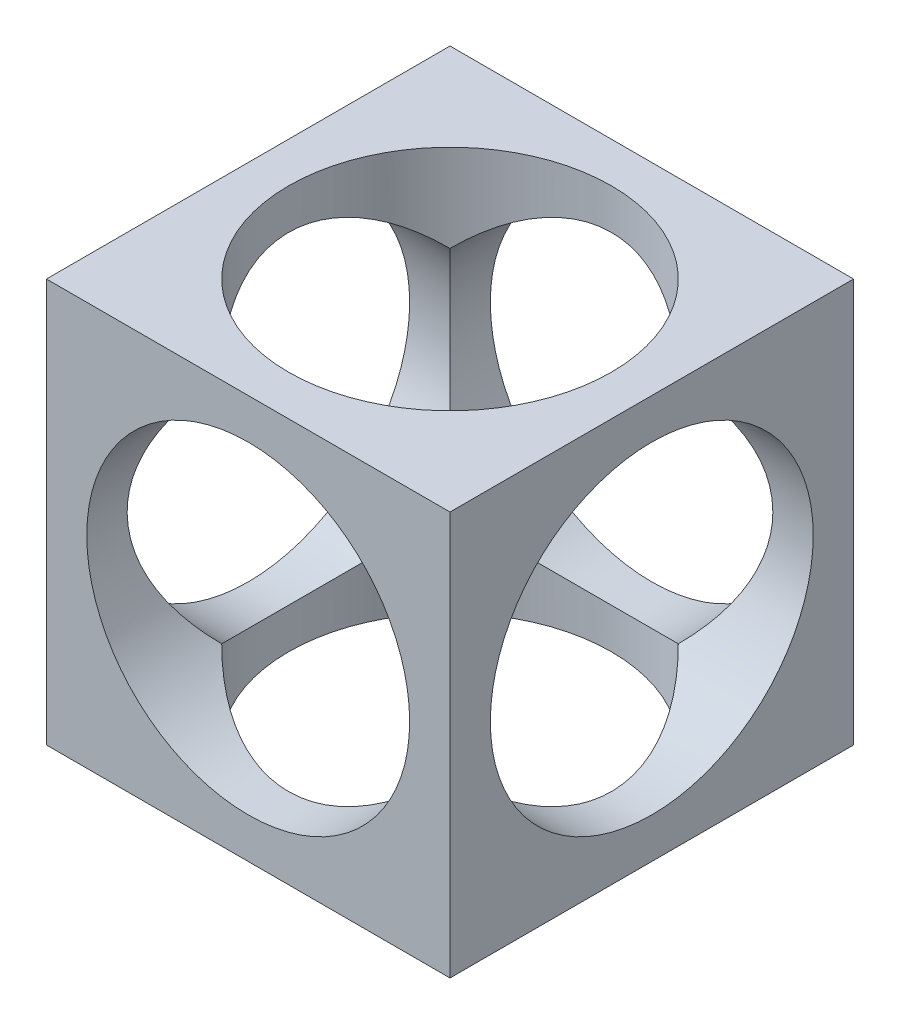
ISO-10303-21;
HEADER;
FILE_DESCRIPTION(('STEP AP214'),'2;1');
FILE_NAME('part.step','',(''),(''),'','','');
FILE_SCHEMA(('AUTOMOTIVE_DESIGN { 1 0 10303 214 1 1 1 1 }'));
ENDSEC;
DATA;
#1=APPLICATION_CONTEXT('core data for automotive mechanical design processes');
#2=APPLICATION_PROTOCOL_DEFINITION('international standard','automotive_design',2000,#1);
#3=PRODUCT_CONTEXT('',#1,'mechanical');
#4=PRODUCT('Part','Part','',(#3));
#5=PRODUCT_RELATED_PRODUCT_CATEGORY('part','',(#4));
#6=PRODUCT_DEFINITION_FORMATION('','',#4);
#7=PRODUCT_DEFINITION_CONTEXT('part definition',#1,'design');
#8=PRODUCT_DEFINITION('design','',#6,#7);
#9=PRODUCT_DEFINITION_SHAPE('','',#8);
#10=(LENGTH_UNIT() NAMED_UNIT(*) SI_UNIT(.MILLI.,.METRE.));
#11=(NAMED_UNIT(*) PLANE_ANGLE_UNIT() SI_UNIT($,.RADIAN.));
#12=(NAMED_UNIT(*) SI_UNIT($,.STERADIAN.) SOLID_ANGLE_UNIT());
#13=UNCERTAINTY_MEASURE_WITH_UNIT(LENGTH_MEASURE(1.E-05),#10,'distance_accuracy_value','');
#14=(GEOMETRIC_REPRESENTATION_CONTEXT(3) GLOBAL_UNCERTAINTY_ASSIGNED_CONTEXT((#13)) GLOBAL_UNIT_ASSIGNED_CONTEXT((#10,
#11,#12)) REPRESENTATION_CONTEXT('',''));
#15=CARTESIAN_POINT('',(0.,0.,0.));
#16=DIRECTION('',(0.,0.,1.));
#17=DIRECTION('',(1.,0.,0.));
#18=AXIS2_PLACEMENT_3D('',#15,#16,#17);
#19=CARTESIAN_POINT('',(50.,50.,0.));
#20=DIRECTION('',(0.,0.,1.));
#21=DIRECTION('',(1.,0.,0.));
#22=AXIS2_PLACEMENT_3D('',#19,#20,#21);
#23=CYLINDRICAL_SURFACE('',#22,40.);
#24=CARTESIAN_POINT('',(50.,50.,100.));
#25=DIRECTION('',(0.,0.,1.));
#26=DIRECTION('',(1.,0.,0.));
#27=AXIS2_PLACEMENT_3D('',#24,#25,#26);
#28=CIRCLE('',#27,40.);
#29=CARTESIAN_POINT('',(90.,50.,100.));
#30=VERTEX_POINT('',#29);
#31=EDGE_CURVE('E202',#30,#30,#28,.T.);
#32=ORIENTED_EDGE('',*,*,#31,.T.);
#33=EDGE_LOOP('',(#32));
#34=FACE_BOUND('',#33,.T.);
#35=CARTESIAN_POINT('',(50.,50.,50.));
#36=DIRECTION('',(-0.707106781186547,0.,0.707106781186547));
#37=DIRECTION('',(0.707106781186547,0.,0.707106781186547));
#38=AXIS2_PLACEMENT_3D('',#35,#36,#37);
#39=ELLIPSE('',#38,56.5685424949238,40.);
#40=CARTESIAN_POINT('',(78.2842712474619,78.2842712474619,78.2842712474619));
#41=VERTEX_POINT('',#40);
#42=CARTESIAN_POINT('',(78.2842712474619,21.7157287525381,78.2842712474619));
#43=VERTEX_POINT('',#42);
#44=EDGE_CURVE('E140',#41,#43,#39,.F.);
#45=ORIENTED_EDGE('',*,*,#44,.T.);
#46=CARTESIAN_POINT('',(50.,50.,50.));
#47=DIRECTION('',(0.,0.707106781186547,0.707106781186547));
#48=DIRECTION('',(0.,-0.707106781186547,0.707106781186547));
#49=AXIS2_PLACEMENT_3D('',#46,#47,#48);
#50=ELLIPSE('',#49,56.5685424949238,40.);
#51=CARTESIAN_POINT('',(21.7157287525381,21.7157287525381,78.2842712474619));
#52=VERTEX_POINT('',#51);
#53=EDGE_CURVE('E128',#43,#52,#50,.F.);
#54=ORIENTED_EDGE('',*,*,#53,.T.);
#55=CARTESIAN_POINT('',(50.,50.,50.));
#56=DIRECTION('',(0.707106781186547,0.,0.707106781186547));
#57=DIRECTION('',(-0.707106781186547,0.,0.707106781186547));
#58=AXIS2_PLACEMENT_3D('',#55,#56,#57);
#59=ELLIPSE('',#58,56.5685424949238,40.);
#60=CARTESIAN_POINT('',(21.7157287525381,78.2842712474619,78.2842712474619));
#61=VERTEX_POINT('',#60);
#62=EDGE_CURVE('E135',#52,#61,#59,.F.);
#63=ORIENTED_EDGE('',*,*,#62,.T.);
#64=CARTESIAN_POINT('',(50.,50.,50.));
#65=DIRECTION('',(0.,-0.707106781186547,0.707106781186547));
#66=DIRECTION('',(0.,0.707106781186547,0.707106781186547));
#67=AXIS2_PLACEMENT_3D('',#64,#65,#66);
#68=ELLIPSE('',#67,56.5685424949238,40.);
#69=EDGE_CURVE('E80',#61,#41,#68,.F.);
#70=ORIENTED_EDGE('',*,*,#69,.T.);
#71=EDGE_LOOP('',(#45,#54,#63,#70));
#72=FACE_BOUND('',#71,.T.);
#73=ADVANCED_FACE('F64',(#34,#72),#23,.F.);
#74=CARTESIAN_POINT('',(0.,0.,0.));
#75=DIRECTION('',(0.,0.,1.));
#76=DIRECTION('',(1.,0.,0.));
#77=AXIS2_PLACEMENT_3D('',#74,#75,#76);
#78=PLANE('',#77);
#79=CARTESIAN_POINT('',(50.,50.,0.));
#80=DIRECTION('',(0.,0.,1.));
#81=DIRECTION('',(1.,0.,0.));
#82=AXIS2_PLACEMENT_3D('',#79,#80,#81);
#83=CIRCLE('',#82,40.);
#84=CARTESIAN_POINT('',(90.,50.,0.));
#85=VERTEX_POINT('',#84);
#86=EDGE_CURVE('E188',#85,#85,#83,.T.);
#87=ORIENTED_EDGE('',*,*,#86,.T.);
#88=EDGE_LOOP('',(#87));
#89=FACE_BOUND('',#88,.T.);
#90=DIRECTION('',(1.,0.,0.));
#91=VECTOR('',#90,1.);
#92=CARTESIAN_POINT('',(0.,0.,0.));
#93=LINE('',#92,#91);
#94=CARTESIAN_POINT('',(0.,0.,0.));
#95=VERTEX_POINT('',#94);
#96=CARTESIAN_POINT('',(100.,0.,0.));
#97=VERTEX_POINT('',#96);
#98=EDGE_CURVE('E184',#95,#97,#93,.T.);
#99=ORIENTED_EDGE('',*,*,#98,.F.);
#100=DIRECTION('',(0.,1.,0.));
#101=VECTOR('',#100,1.);
#102=CARTESIAN_POINT('',(0.,0.,0.));
#103=LINE('',#102,#101);
#104=CARTESIAN_POINT('',(0.,100.,0.));
#105=VERTEX_POINT('',#104);
#106=EDGE_CURVE('E171',#95,#105,#103,.T.);
#107=ORIENTED_EDGE('',*,*,#106,.T.);
#108=DIRECTION('',(1.,0.,0.));
#109=VECTOR('',#108,1.);
#110=CARTESIAN_POINT('',(0.,100.,0.));
#111=LINE('',#110,#109);
#112=CARTESIAN_POINT('',(100.,100.,0.));
#113=VERTEX_POINT('',#112);
#114=EDGE_CURVE('E176',#105,#113,#111,.T.);
#115=ORIENTED_EDGE('',*,*,#114,.T.);
#116=DIRECTION('',(0.,1.,0.));
#117=VECTOR('',#116,1.);
#118=CARTESIAN_POINT('',(100.,0.,0.));
#119=LINE('',#118,#117);
#120=EDGE_CURVE('E180',#97,#113,#119,.T.);
#121=ORIENTED_EDGE('',*,*,#120,.F.);
#122=EDGE_LOOP('',(#99,#107,#115,#121));
#123=FACE_BOUND('',#122,.T.);
#124=ADVANCED_FACE('F255',(#89,#123),#78,.F.);
#125=CARTESIAN_POINT('',(100.,0.,100.));
#126=DIRECTION('',(-1.,0.,0.));
#127=DIRECTION('',(0.,0.,1.));
#128=AXIS2_PLACEMENT_3D('',#125,#126,#127);
#129=PLANE('',#128);
#130=CARTESIAN_POINT('',(100.,50.,50.));
#131=DIRECTION('',(1.,0.,0.));
#132=DIRECTION('',(0.,0.,-1.));
#133=AXIS2_PLACEMENT_3D('',#130,#131,#132);
#134=CIRCLE('',#133,40.);
#135=CARTESIAN_POINT('',(100.,50.,9.99999999999998));
#136=VERTEX_POINT('',#135);
#137=EDGE_CURVE('E210',#136,#136,#134,.T.);
#138=ORIENTED_EDGE('',*,*,#137,.F.);
#139=EDGE_LOOP('',(#138));
#140=FACE_BOUND('',#139,.T.);
#141=ORIENTED_EDGE('',*,*,#120,.T.);
#142=DIRECTION('',(0.,0.,-1.));
#143=VECTOR('',#142,1.);
#144=CARTESIAN_POINT('',(100.,100.,100.));
#145=LINE('',#144,#143);
#146=CARTESIAN_POINT('',(100.,100.,100.));
#147=VERTEX_POINT('',#146);
#148=EDGE_CURVE('E161',#147,#113,#145,.T.);
#149=ORIENTED_EDGE('',*,*,#148,.F.);
#150=DIRECTION('',(0.,1.,0.));
#151=VECTOR('',#150,1.);
#152=CARTESIAN_POINT('',(100.,0.,100.));
#153=LINE('',#152,#151);
#154=CARTESIAN_POINT('',(100.,0.,100.));
#155=VERTEX_POINT('',#154);
#156=EDGE_CURVE('E196',#155,#147,#153,.T.);
#157=ORIENTED_EDGE('',*,*,#156,.F.);
#158=DIRECTION('',(0.,0.,-1.));
#159=VECTOR('',#158,1.);
#160=CARTESIAN_POINT('',(100.,0.,100.));
#161=LINE('',#160,#159);
#162=EDGE_CURVE('E157',#155,#97,#161,.T.);
#163=ORIENTED_EDGE('',*,*,#162,.T.);
#164=EDGE_LOOP('',(#141,#149,#157,#163));
#165=FACE_BOUND('',#164,.T.);
#166=ADVANCED_FACE('F259',(#140,#165),#129,.F.);
#167=CARTESIAN_POINT('',(0.,0.,100.));
#168=DIRECTION('',(0.,1.,0.));
#169=DIRECTION('',(0.,0.,1.));
#170=AXIS2_PLACEMENT_3D('',#167,#168,#169);
#171=PLANE('',#170);
#172=CARTESIAN_POINT('',(50.,0.,50.));
#173=DIRECTION('',(0.,1.,0.));
#174=DIRECTION('',(0.,0.,1.));
#175=AXIS2_PLACEMENT_3D('',#172,#173,#174);
#176=CIRCLE('',#175,40.);
#177=CARTESIAN_POINT('',(50.,0.,90.));
#178=VERTEX_POINT('',#177);
#179=EDGE_CURVE('E231',#178,#178,#176,.T.);
#180=ORIENTED_EDGE('',*,*,#179,.T.);
#181=EDGE_LOOP('',(#180));
#182=FACE_BOUND('',#181,.T.);
#183=ORIENTED_EDGE('',*,*,#98,.T.);
#184=ORIENTED_EDGE('',*,*,#162,.F.);
#185=DIRECTION('',(1.,0.,0.));
#186=VECTOR('',#185,1.);
#187=CARTESIAN_POINT('',(0.,0.,100.));
#188=LINE('',#187,#186);
#189=CARTESIAN_POINT('',(0.,0.,100.));
#190=VERTEX_POINT('',#189);
#191=EDGE_CURVE('E175',#190,#155,#188,.T.);
#192=ORIENTED_EDGE('',*,*,#191,.F.);
#193=DIRECTION('',(0.,0.,-1.));
#194=VECTOR('',#193,1.);
#195=CARTESIAN_POINT('',(0.,0.,100.));
#196=LINE('',#195,#194);
#197=EDGE_CURVE('E167',#190,#95,#196,.T.);
#198=ORIENTED_EDGE('',*,*,#197,.T.);
#199=EDGE_LOOP('',(#183,#184,#192,#198));
#200=FACE_BOUND('',#199,.T.);
#201=ADVANCED_FACE('F66',(#182,#200),#171,.F.);
#202=CARTESIAN_POINT('',(0.,0.,100.));
#203=DIRECTION('',(-1.,0.,0.));
#204=DIRECTION('',(0.,0.,1.));
#205=AXIS2_PLACEMENT_3D('',#202,#203,#204);
#206=PLANE('',#205);
#207=CARTESIAN_POINT('',(0.,50.,50.));
#208=DIRECTION('',(1.,0.,0.));
#209=DIRECTION('',(0.,0.,-1.));
#210=AXIS2_PLACEMENT_3D('',#207,#208,#209);
#211=CIRCLE('',#210,40.);
#212=CARTESIAN_POINT('',(0.,50.,9.99999999999998));
#213=VERTEX_POINT('',#212);
#214=EDGE_CURVE('E206',#213,#213,#211,.T.);
#215=ORIENTED_EDGE('',*,*,#214,.T.);
#216=EDGE_LOOP('',(#215));
#217=FACE_BOUND('',#216,.T.);
#218=ORIENTED_EDGE('',*,*,#106,.F.);
#219=ORIENTED_EDGE('',*,*,#197,.F.);
#220=DIRECTION('',(0.,1.,0.));
#221=VECTOR('',#220,1.);
#222=CARTESIAN_POINT('',(0.,0.,100.));
#223=LINE('',#222,#221);
#224=CARTESIAN_POINT('',(0.,100.,100.));
#225=VERTEX_POINT('',#224);
#226=EDGE_CURVE('E170',#190,#225,#223,.T.);
#227=ORIENTED_EDGE('',*,*,#226,.T.);
#228=DIRECTION('',(0.,0.,-1.));
#229=VECTOR('',#228,1.);
#230=CARTESIAN_POINT('',(0.,100.,100.));
#231=LINE('',#230,#229);
#232=EDGE_CURVE('E164',#225,#105,#231,.T.);
#233=ORIENTED_EDGE('',*,*,#232,.T.);
#234=EDGE_LOOP('',(#218,#219,#227,#233));
#235=FACE_BOUND('',#234,.T.);
#236=ADVANCED_FACE('F276',(#217,#235),#206,.T.);
#237=CARTESIAN_POINT('',(0.,100.,100.));
#238=DIRECTION('',(0.,1.,0.));
#239=DIRECTION('',(0.,0.,1.));
#240=AXIS2_PLACEMENT_3D('',#237,#238,#239);
#241=PLANE('',#240);
#242=CARTESIAN_POINT('',(50.,100.,50.));
#243=DIRECTION('',(0.,1.,0.));
#244=DIRECTION('',(0.,0.,1.));
#245=AXIS2_PLACEMENT_3D('',#242,#243,#244);
#246=CIRCLE('',#245,40.);
#247=CARTESIAN_POINT('',(50.,100.,90.));
#248=VERTEX_POINT('',#247);
#249=EDGE_CURVE('E232',#248,#248,#246,.T.);
#250=ORIENTED_EDGE('',*,*,#249,.F.);
#251=EDGE_LOOP('',(#250));
#252=FACE_BOUND('',#251,.T.);
#253=ORIENTED_EDGE('',*,*,#114,.F.);
#254=ORIENTED_EDGE('',*,*,#232,.F.);
#255=DIRECTION('',(1.,0.,0.));
#256=VECTOR('',#255,1.);
#257=CARTESIAN_POINT('',(0.,100.,100.));
#258=LINE('',#257,#256);
#259=EDGE_CURVE('E192',#225,#147,#258,.T.);
#260=ORIENTED_EDGE('',*,*,#259,.T.);
#261=ORIENTED_EDGE('',*,*,#148,.T.);
#262=EDGE_LOOP('',(#253,#254,#260,#261));
#263=FACE_BOUND('',#262,.T.);
#264=ADVANCED_FACE('F280',(#252,#263),#241,.T.);
#265=CARTESIAN_POINT('',(0.,0.,100.));
#266=DIRECTION('',(0.,0.,1.));
#267=DIRECTION('',(1.,0.,0.));
#268=AXIS2_PLACEMENT_3D('',#265,#266,#267);
#269=PLANE('',#268);
#270=ORIENTED_EDGE('',*,*,#31,.F.);
#271=EDGE_LOOP('',(#270));
#272=FACE_BOUND('',#271,.T.);
#273=ORIENTED_EDGE('',*,*,#191,.T.);
#274=ORIENTED_EDGE('',*,*,#156,.T.);
#275=ORIENTED_EDGE('',*,*,#259,.F.);
#276=ORIENTED_EDGE('',*,*,#226,.F.);
#277=EDGE_LOOP('',(#273,#274,#275,#276));
#278=FACE_BOUND('',#277,.T.);
#279=ADVANCED_FACE('F269',(#272,#278),#269,.T.);
#280=CARTESIAN_POINT('',(50.,50.,50.));
#281=DIRECTION('',(0.707106781186547,0.,0.707106781186547));
#282=DIRECTION('',(-0.707106781186547,0.,0.707106781186547));
#283=AXIS2_PLACEMENT_3D('',#280,#281,#282);
#284=ELLIPSE('',#283,56.5685424949238,40.);
#285=CARTESIAN_POINT('',(78.2842712474619,21.7157287525381,21.7157287525381));
#286=VERTEX_POINT('',#285);
#287=CARTESIAN_POINT('',(78.2842712474619,78.2842712474619,21.7157287525381));
#288=VERTEX_POINT('',#287);
#289=EDGE_CURVE('E146',#286,#288,#284,.T.);
#290=ORIENTED_EDGE('',*,*,#289,.T.);
#291=CARTESIAN_POINT('',(50.,50.,50.));
#292=DIRECTION('',(0.,0.707106781186547,0.707106781186547));
#293=DIRECTION('',(0.,-0.707106781186547,0.707106781186547));
#294=AXIS2_PLACEMENT_3D('',#291,#292,#293);
#295=ELLIPSE('',#294,56.5685424949238,40.);
#296=CARTESIAN_POINT('',(21.7157287525381,78.2842712474619,21.7157287525381));
#297=VERTEX_POINT('',#296);
#298=EDGE_CURVE('E223',#288,#297,#295,.T.);
#299=ORIENTED_EDGE('',*,*,#298,.T.);
#300=CARTESIAN_POINT('',(50.,50.,50.));
#301=DIRECTION('',(-0.707106781186547,0.,0.707106781186547));
#302=DIRECTION('',(0.707106781186547,0.,0.707106781186547));
#303=AXIS2_PLACEMENT_3D('',#300,#301,#302);
#304=ELLIPSE('',#303,56.5685424949238,40.);
#305=CARTESIAN_POINT('',(21.7157287525381,21.7157287525381,21.7157287525381));
#306=VERTEX_POINT('',#305);
#307=EDGE_CURVE('E150',#297,#306,#304,.T.);
#308=ORIENTED_EDGE('',*,*,#307,.T.);
#309=CARTESIAN_POINT('',(50.,50.,50.));
#310=DIRECTION('',(0.,-0.707106781186547,0.707106781186547));
#311=DIRECTION('',(0.,0.707106781186547,0.707106781186547));
#312=AXIS2_PLACEMENT_3D('',#309,#310,#311);
#313=ELLIPSE('',#312,56.5685424949238,40.);
#314=EDGE_CURVE('E87',#306,#286,#313,.T.);
#315=ORIENTED_EDGE('',*,*,#314,.T.);
#316=EDGE_LOOP('',(#290,#299,#308,#315));
#317=FACE_BOUND('',#316,.T.);
#318=ORIENTED_EDGE('',*,*,#86,.F.);
#319=EDGE_LOOP('',(#318));
#320=FACE_BOUND('',#319,.T.);
#321=ADVANCED_FACE('F258',(#317,#320),#23,.F.);
#322=CARTESIAN_POINT('',(0.,50.,50.));
#323=DIRECTION('',(1.,0.,0.));
#324=DIRECTION('',(0.,0.,-1.));
#325=AXIS2_PLACEMENT_3D('',#322,#323,#324);
#326=CYLINDRICAL_SURFACE('',#325,40.);
#327=ORIENTED_EDGE('',*,*,#137,.T.);
#328=EDGE_LOOP('',(#327));
#329=FACE_BOUND('',#328,.T.);
#330=ORIENTED_EDGE('',*,*,#289,.F.);
#331=CARTESIAN_POINT('',(50.,50.,50.));
#332=DIRECTION('',(0.707106781186547,0.707106781186547,0.));
#333=DIRECTION('',(0.707106781186547,-0.707106781186547,0.));
#334=AXIS2_PLACEMENT_3D('',#331,#332,#333);
#335=ELLIPSE('',#334,56.5685424949238,40.);
#336=EDGE_CURVE('E142',#286,#43,#335,.F.);
#337=ORIENTED_EDGE('',*,*,#336,.T.);
#338=ORIENTED_EDGE('',*,*,#44,.F.);
#339=CARTESIAN_POINT('',(50.,50.,50.));
#340=DIRECTION('',(0.707106781186547,-0.707106781186547,0.));
#341=DIRECTION('',(0.707106781186547,0.707106781186547,0.));
#342=AXIS2_PLACEMENT_3D('',#339,#340,#341);
#343=ELLIPSE('',#342,56.5685424949238,40.);
#344=EDGE_CURVE('E214',#41,#288,#343,.F.);
#345=ORIENTED_EDGE('',*,*,#344,.T.);
#346=EDGE_LOOP('',(#330,#337,#338,#345));
#347=FACE_BOUND('',#346,.T.);
#348=ADVANCED_FACE('F251',(#329,#347),#326,.F.);
#349=ORIENTED_EDGE('',*,*,#214,.F.);
#350=EDGE_LOOP('',(#349));
#351=FACE_BOUND('',#350,.T.);
#352=ORIENTED_EDGE('',*,*,#307,.F.);
#353=CARTESIAN_POINT('',(50.,50.,50.));
#354=DIRECTION('',(0.707106781186547,0.707106781186547,0.));
#355=DIRECTION('',(0.707106781186547,-0.707106781186547,0.));
#356=AXIS2_PLACEMENT_3D('',#353,#354,#355);
#357=ELLIPSE('',#356,56.5685424949238,40.);
#358=EDGE_CURVE('E12',#297,#61,#357,.T.);
#359=ORIENTED_EDGE('',*,*,#358,.T.);
#360=ORIENTED_EDGE('',*,*,#62,.F.);
#361=CARTESIAN_POINT('',(50.,50.,50.));
#362=DIRECTION('',(0.707106781186547,-0.707106781186547,0.));
#363=DIRECTION('',(0.707106781186547,0.707106781186547,0.));
#364=AXIS2_PLACEMENT_3D('',#361,#362,#363);
#365=ELLIPSE('',#364,56.5685424949238,40.);
#366=EDGE_CURVE('E73',#52,#306,#365,.T.);
#367=ORIENTED_EDGE('',*,*,#366,.T.);
#368=EDGE_LOOP('',(#352,#359,#360,#367));
#369=FACE_BOUND('',#368,.T.);
#370=ADVANCED_FACE('F144',(#351,#369),#326,.F.);
#371=CARTESIAN_POINT('',(50.,0.,50.));
#372=DIRECTION('',(0.,1.,0.));
#373=DIRECTION('',(0.,0.,1.));
#374=AXIS2_PLACEMENT_3D('',#371,#372,#373);
#375=CYLINDRICAL_SURFACE('',#374,40.);
#376=ORIENTED_EDGE('',*,*,#179,.F.);
#377=EDGE_LOOP('',(#376));
#378=FACE_BOUND('',#377,.T.);
#379=ORIENTED_EDGE('',*,*,#314,.F.);
#380=ORIENTED_EDGE('',*,*,#366,.F.);
#381=ORIENTED_EDGE('',*,*,#53,.F.);
#382=ORIENTED_EDGE('',*,*,#336,.F.);
#383=EDGE_LOOP('',(#379,#380,#381,#382));
#384=FACE_BOUND('',#383,.T.);
#385=ADVANCED_FACE('F127',(#378,#384),#375,.F.);
#386=ORIENTED_EDGE('',*,*,#249,.T.);
#387=EDGE_LOOP('',(#386));
#388=FACE_BOUND('',#387,.T.);
#389=ORIENTED_EDGE('',*,*,#69,.F.);
#390=ORIENTED_EDGE('',*,*,#358,.F.);
#391=ORIENTED_EDGE('',*,*,#298,.F.);
#392=ORIENTED_EDGE('',*,*,#344,.F.);
#393=EDGE_LOOP('',(#389,#390,#391,#392));
#394=FACE_BOUND('',#393,.T.);
#395=ADVANCED_FACE('F243',(#388,#394),#375,.F.);
#396=CLOSED_SHELL('',(#73,#124,#166,#201,#236,#264,#279,#321,#348,#370,#385,#395));
#397=MANIFOLD_SOLID_BREP('B2',#396);
#398=ADVANCED_BREP_SHAPE_REPRESENTATION('',(#18,#397),#14);
#399=SHAPE_DEFINITION_REPRESENTATION(#9,#398);
ENDSEC;
END-ISO-10303-21;
